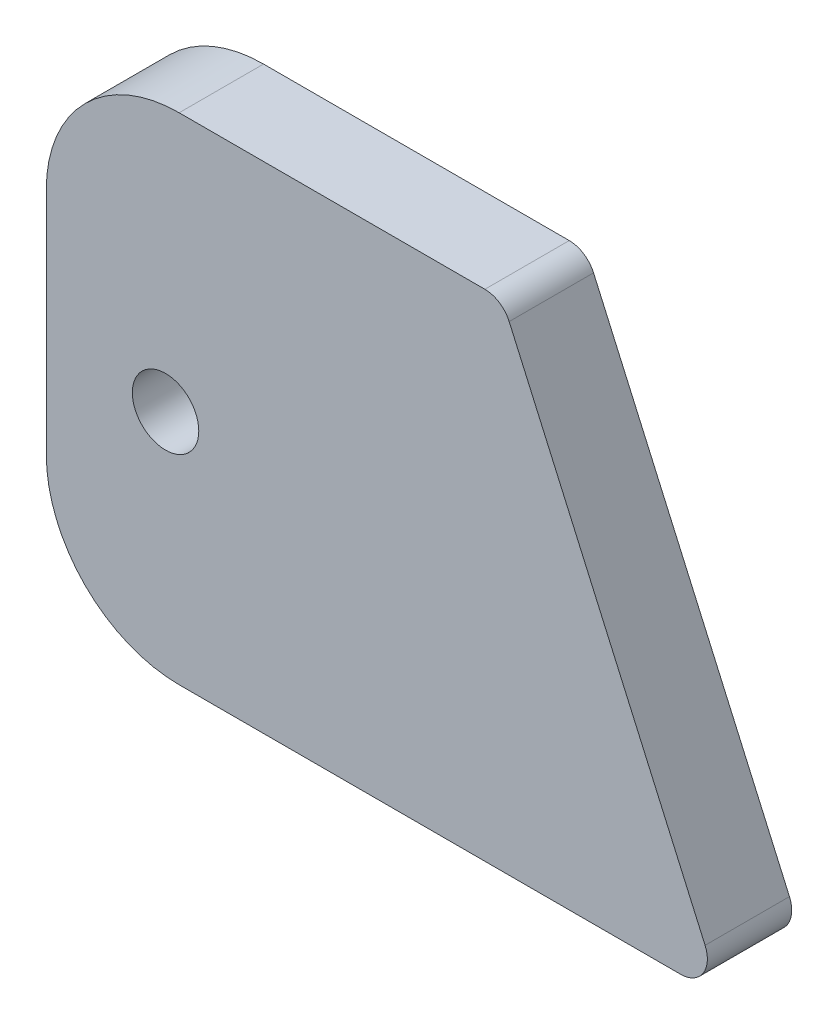
ISO-10303-21;
HEADER;
FILE_DESCRIPTION(('STEP AP214'),'2;1');
FILE_NAME('part.step','',(''),(''),'','','');
FILE_SCHEMA(('AUTOMOTIVE_DESIGN { 1 0 10303 214 1 1 1 1 }'));
ENDSEC;
DATA;
#1=APPLICATION_CONTEXT('core data for automotive mechanical design processes');
#2=APPLICATION_PROTOCOL_DEFINITION('international standard','automotive_design',2000,#1);
#3=PRODUCT_CONTEXT('',#1,'mechanical');
#4=PRODUCT('Part','Part','',(#3));
#5=PRODUCT_RELATED_PRODUCT_CATEGORY('part','',(#4));
#6=PRODUCT_DEFINITION_FORMATION('','',#4);
#7=PRODUCT_DEFINITION_CONTEXT('part definition',#1,'design');
#8=PRODUCT_DEFINITION('design','',#6,#7);
#9=PRODUCT_DEFINITION_SHAPE('','',#8);
#10=(LENGTH_UNIT() NAMED_UNIT(*) SI_UNIT(.MILLI.,.METRE.));
#11=(NAMED_UNIT(*) PLANE_ANGLE_UNIT() SI_UNIT($,.RADIAN.));
#12=(NAMED_UNIT(*) SI_UNIT($,.STERADIAN.) SOLID_ANGLE_UNIT());
#13=UNCERTAINTY_MEASURE_WITH_UNIT(LENGTH_MEASURE(1.E-05),#10,'distance_accuracy_value','');
#14=(GEOMETRIC_REPRESENTATION_CONTEXT(3) GLOBAL_UNCERTAINTY_ASSIGNED_CONTEXT((#13)) GLOBAL_UNIT_ASSIGNED_CONTEXT((#10,
#11,#12)) REPRESENTATION_CONTEXT('',''));
#15=CARTESIAN_POINT('',(0.,0.,0.));
#16=DIRECTION('',(0.,0.,1.));
#17=DIRECTION('',(1.,0.,0.));
#18=AXIS2_PLACEMENT_3D('',#15,#16,#17);
#19=CARTESIAN_POINT('',(5.33973329874302,9.32089354000001,1.5875));
#20=DIRECTION('',(-0.914302268590773,-0.405032543939084,0.));
#21=DIRECTION('',(0.405032543939084,-0.914302268590773,0.));
#22=AXIS2_PLACEMENT_3D('',#19,#20,#21);
#23=PLANE('',#22);
#24=DIRECTION('',(-0.405032543939084,0.914302268590773,0.));
#25=VECTOR('',#24,1.);
#26=CARTESIAN_POINT('',(5.33973329874302,9.32089354000001,1.5875));
#27=LINE('',#26,#25);
#28=CARTESIAN_POINT('',(12.9755521945606,-7.91586099606091,1.5875));
#29=VERTEX_POINT('',#28);
#30=CARTESIAN_POINT('',(5.60330169463111,8.72592608393909,1.5875));
#31=VERTEX_POINT('',#30);
#32=EDGE_CURVE('E126',#29,#31,#27,.T.);
#33=ORIENTED_EDGE('',*,*,#32,.F.);
#34=DIRECTION('',(0.,0.,-1.));
#35=VECTOR('',#34,1.);
#36=CARTESIAN_POINT('',(12.9755521945606,-7.91586099606091,1.5875));
#37=LINE('',#36,#35);
#38=CARTESIAN_POINT('',(12.9755521945606,-7.91586099606091,-1.5875));
#39=VERTEX_POINT('',#38);
#40=EDGE_CURVE('E112',#29,#39,#37,.T.);
#41=ORIENTED_EDGE('',*,*,#40,.T.);
#42=DIRECTION('',(-0.405032543939084,0.914302268590773,0.));
#43=VECTOR('',#42,1.);
#44=CARTESIAN_POINT('',(5.33973329874302,9.32089354000001,-1.5875));
#45=LINE('',#44,#43);
#46=CARTESIAN_POINT('',(5.60330169463111,8.72592608393909,-1.5875));
#47=VERTEX_POINT('',#46);
#48=EDGE_CURVE('E123',#39,#47,#45,.T.);
#49=ORIENTED_EDGE('',*,*,#48,.T.);
#50=DIRECTION('',(0.,0.,-1.));
#51=VECTOR('',#50,1.);
#52=CARTESIAN_POINT('',(5.60330169463111,8.72592608393909,1.5875));
#53=LINE('',#52,#51);
#54=EDGE_CURVE('E127',#47,#31,#53,.F.);
#55=ORIENTED_EDGE('',*,*,#54,.T.);
#56=EDGE_LOOP('',(#33,#41,#49,#55));
#57=FACE_BOUND('',#56,.T.);
#58=ADVANCED_FACE('F39',(#57),#23,.F.);
#59=CARTESIAN_POINT('',(4.68327461791519,9.32089354000001,1.5875));
#60=DIRECTION('',(0.,-1.,0.));
#61=DIRECTION('',(1.,0.,0.));
#62=AXIS2_PLACEMENT_3D('',#59,#60,#61);
#63=PLANE('',#62);
#64=DIRECTION('',(-1.,0.,0.));
#65=VECTOR('',#64,1.);
#66=CARTESIAN_POINT('',(4.68327461791519,9.32089354000001,-1.5875));
#67=LINE('',#66,#65);
#68=CARTESIAN_POINT('',(4.68899942604034,9.32089354000001,-1.5875));
#69=VERTEX_POINT('',#68);
#70=CARTESIAN_POINT('',(-6.81540086,9.32089354000001,-1.5875));
#71=VERTEX_POINT('',#70);
#72=EDGE_CURVE('E132',#69,#71,#67,.T.);
#73=ORIENTED_EDGE('',*,*,#72,.T.);
#74=DIRECTION('',(0.,0.,-1.));
#75=VECTOR('',#74,1.);
#76=CARTESIAN_POINT('',(-6.81540086,9.32089354000001,1.5875));
#77=LINE('',#76,#75);
#78=CARTESIAN_POINT('',(-6.81540086,9.32089353999998,1.5875));
#79=VERTEX_POINT('',#78);
#80=EDGE_CURVE('E62',#71,#79,#77,.F.);
#81=ORIENTED_EDGE('',*,*,#80,.T.);
#82=DIRECTION('',(-1.,0.,0.));
#83=VECTOR('',#82,1.);
#84=CARTESIAN_POINT('',(4.68327461791519,9.32089354000001,1.5875));
#85=LINE('',#84,#83);
#86=CARTESIAN_POINT('',(4.68899942604034,9.32089354000001,1.5875));
#87=VERTEX_POINT('',#86);
#88=EDGE_CURVE('E172',#87,#79,#85,.T.);
#89=ORIENTED_EDGE('',*,*,#88,.F.);
#90=DIRECTION('',(0.,0.,-1.));
#91=VECTOR('',#90,1.);
#92=CARTESIAN_POINT('',(4.68899942604034,9.32089354000001,1.5875));
#93=LINE('',#92,#91);
#94=EDGE_CURVE('E156',#87,#69,#93,.T.);
#95=ORIENTED_EDGE('',*,*,#94,.T.);
#96=EDGE_LOOP('',(#73,#81,#89,#95));
#97=FACE_BOUND('',#96,.T.);
#98=ADVANCED_FACE('F179',(#97),#63,.F.);
#99=CARTESIAN_POINT('',(-11.81540086,9.32089354,1.5875));
#100=DIRECTION('',(1.,0.,0.));
#101=DIRECTION('',(0.,1.,0.));
#102=AXIS2_PLACEMENT_3D('',#99,#100,#101);
#103=PLANE('',#102);
#104=DIRECTION('',(0.,-1.,0.));
#105=VECTOR('',#104,1.);
#106=CARTESIAN_POINT('',(-11.81540086,9.32089354,1.5875));
#107=LINE('',#106,#105);
#108=CARTESIAN_POINT('',(-11.81540086,4.32089354000001,1.5875));
#109=VERTEX_POINT('',#108);
#110=CARTESIAN_POINT('',(-11.81540086,-4.32089354,1.5875));
#111=VERTEX_POINT('',#110);
#112=EDGE_CURVE('E141',#109,#111,#107,.T.);
#113=ORIENTED_EDGE('',*,*,#112,.F.);
#114=DIRECTION('',(0.,0.,-1.));
#115=VECTOR('',#114,1.);
#116=CARTESIAN_POINT('',(-11.81540086,4.32089354000001,1.5875));
#117=LINE('',#116,#115);
#118=CARTESIAN_POINT('',(-11.81540086,4.32089354000001,-1.5875));
#119=VERTEX_POINT('',#118);
#120=EDGE_CURVE('E161',#109,#119,#117,.T.);
#121=ORIENTED_EDGE('',*,*,#120,.T.);
#122=DIRECTION('',(0.,-1.,0.));
#123=VECTOR('',#122,1.);
#124=CARTESIAN_POINT('',(-11.81540086,9.32089354,-1.5875));
#125=LINE('',#124,#123);
#126=CARTESIAN_POINT('',(-11.81540086,-4.32089354,-1.5875));
#127=VERTEX_POINT('',#126);
#128=EDGE_CURVE('E135',#119,#127,#125,.T.);
#129=ORIENTED_EDGE('',*,*,#128,.T.);
#130=DIRECTION('',(0.,0.,-1.));
#131=VECTOR('',#130,1.);
#132=CARTESIAN_POINT('',(-11.81540086,-4.32089354,1.5875));
#133=LINE('',#132,#131);
#134=EDGE_CURVE('E159',#127,#111,#133,.F.);
#135=ORIENTED_EDGE('',*,*,#134,.T.);
#136=EDGE_LOOP('',(#113,#121,#129,#135));
#137=FACE_BOUND('',#136,.T.);
#138=ADVANCED_FACE('F176',(#137),#103,.F.);
#139=CARTESIAN_POINT('',(-11.81540086,-9.32089354,1.5875));
#140=DIRECTION('',(0.,1.,0.));
#141=DIRECTION('',(-1.,0.,0.));
#142=AXIS2_PLACEMENT_3D('',#139,#140,#141);
#143=PLANE('',#142);
#144=DIRECTION('',(1.,0.,0.));
#145=VECTOR('',#144,1.);
#146=CARTESIAN_POINT('',(13.5979764465161,-9.32089353999999,1.5875));
#147=LINE('',#146,#145);
#148=CARTESIAN_POINT('',(-6.81540085999999,-9.32089353999994,1.5875));
#149=VERTEX_POINT('',#148);
#150=CARTESIAN_POINT('',(12.0612499259698,-9.32089353999999,1.5875));
#151=VERTEX_POINT('',#150);
#152=EDGE_CURVE('E148',#149,#151,#147,.T.);
#153=ORIENTED_EDGE('',*,*,#152,.F.);
#154=DIRECTION('',(0.,0.,-1.));
#155=VECTOR('',#154,1.);
#156=CARTESIAN_POINT('',(-6.81540086,-9.32089353999999,1.5875));
#157=LINE('',#156,#155);
#158=CARTESIAN_POINT('',(-6.81540086,-9.32089353999999,-1.5875));
#159=VERTEX_POINT('',#158);
#160=EDGE_CURVE('E11',#149,#159,#157,.T.);
#161=ORIENTED_EDGE('',*,*,#160,.T.);
#162=DIRECTION('',(1.,0.,0.));
#163=VECTOR('',#162,1.);
#164=CARTESIAN_POINT('',(-11.81540086,-9.32089354,-1.5875));
#165=LINE('',#164,#163);
#166=CARTESIAN_POINT('',(12.0612499259698,-9.32089353999999,-1.5875));
#167=VERTEX_POINT('',#166);
#168=EDGE_CURVE('E146',#159,#167,#165,.T.);
#169=ORIENTED_EDGE('',*,*,#168,.T.);
#170=DIRECTION('',(0.,0.,-1.));
#171=VECTOR('',#170,1.);
#172=CARTESIAN_POINT('',(12.0612499259698,-9.32089353999999,1.5875));
#173=LINE('',#172,#171);
#174=EDGE_CURVE('E114',#167,#151,#173,.F.);
#175=ORIENTED_EDGE('',*,*,#174,.T.);
#176=EDGE_LOOP('',(#153,#161,#169,#175));
#177=FACE_BOUND('',#176,.T.);
#178=ADVANCED_FACE('F193',(#177),#143,.F.);
#179=CARTESIAN_POINT('',(0.,0.,1.5875));
#180=DIRECTION('',(0.,0.,1.));
#181=DIRECTION('',(1.,0.,0.));
#182=AXIS2_PLACEMENT_3D('',#179,#180,#181);
#183=PLANE('',#182);
#184=CARTESIAN_POINT('',(-7.3274835,-0.67910646,1.5875));
#185=DIRECTION('',(0.,0.,1.));
#186=DIRECTION('',(1.,0.,0.));
#187=AXIS2_PLACEMENT_3D('',#184,#185,#186);
#188=CIRCLE('',#187,1.25);
#189=CARTESIAN_POINT('',(-6.0774835,-0.67910646,1.5875));
#190=VERTEX_POINT('',#189);
#191=EDGE_CURVE('E138',#190,#190,#188,.T.);
#192=ORIENTED_EDGE('',*,*,#191,.F.);
#193=EDGE_LOOP('',(#192));
#194=FACE_BOUND('',#193,.T.);
#195=ORIENTED_EDGE('',*,*,#88,.T.);
#196=CARTESIAN_POINT('',(-6.81540086,4.32089354,1.5875));
#197=DIRECTION('',(0.,0.,1.));
#198=DIRECTION('',(1.,0.,0.));
#199=AXIS2_PLACEMENT_3D('',#196,#197,#198);
#200=CIRCLE('',#199,5.);
#201=EDGE_CURVE('E47',#79,#109,#200,.T.);
#202=ORIENTED_EDGE('',*,*,#201,.T.);
#203=ORIENTED_EDGE('',*,*,#112,.T.);
#204=CARTESIAN_POINT('',(-6.81540086,-4.32089354,1.5875));
#205=DIRECTION('',(0.,0.,1.));
#206=DIRECTION('',(1.,0.,0.));
#207=AXIS2_PLACEMENT_3D('',#204,#205,#206);
#208=CIRCLE('',#207,5.);
#209=EDGE_CURVE('E54',#111,#149,#208,.T.);
#210=ORIENTED_EDGE('',*,*,#209,.T.);
#211=ORIENTED_EDGE('',*,*,#152,.T.);
#212=CARTESIAN_POINT('',(12.0612499259698,-8.32089353999999,1.5875));
#213=DIRECTION('',(0.,0.,1.));
#214=DIRECTION('',(1.,0.,0.));
#215=AXIS2_PLACEMENT_3D('',#212,#213,#214);
#216=CIRCLE('',#215,1.);
#217=EDGE_CURVE('E154',#151,#29,#216,.T.);
#218=ORIENTED_EDGE('',*,*,#217,.T.);
#219=ORIENTED_EDGE('',*,*,#32,.T.);
#220=CARTESIAN_POINT('',(4.68899942604034,8.32089354000001,1.5875));
#221=DIRECTION('',(0.,0.,1.));
#222=DIRECTION('',(1.,0.,0.));
#223=AXIS2_PLACEMENT_3D('',#220,#221,#222);
#224=CIRCLE('',#223,1.);
#225=EDGE_CURVE('E152',#31,#87,#224,.T.);
#226=ORIENTED_EDGE('',*,*,#225,.T.);
#227=EDGE_LOOP('',(#195,#202,#203,#210,#211,#218,#219,#226));
#228=FACE_BOUND('',#227,.T.);
#229=ADVANCED_FACE('F171',(#194,#228),#183,.T.);
#230=CARTESIAN_POINT('',(0.,0.,-1.5875));
#231=DIRECTION('',(0.,0.,1.));
#232=DIRECTION('',(1.,0.,0.));
#233=AXIS2_PLACEMENT_3D('',#230,#231,#232);
#234=PLANE('',#233);
#235=CARTESIAN_POINT('',(-7.3274835,-0.67910646,-1.5875));
#236=DIRECTION('',(0.,0.,1.));
#237=DIRECTION('',(1.,0.,0.));
#238=AXIS2_PLACEMENT_3D('',#235,#236,#237);
#239=CIRCLE('',#238,1.25);
#240=CARTESIAN_POINT('',(-6.0774835,-0.67910646,-1.5875));
#241=VERTEX_POINT('',#240);
#242=EDGE_CURVE('E133',#241,#241,#239,.T.);
#243=ORIENTED_EDGE('',*,*,#242,.T.);
#244=EDGE_LOOP('',(#243));
#245=FACE_BOUND('',#244,.T.);
#246=ORIENTED_EDGE('',*,*,#128,.F.);
#247=CARTESIAN_POINT('',(-6.81540086,4.32089354,-1.5875));
#248=DIRECTION('',(0.,0.,1.));
#249=DIRECTION('',(1.,0.,0.));
#250=AXIS2_PLACEMENT_3D('',#247,#248,#249);
#251=CIRCLE('',#250,5.);
#252=EDGE_CURVE('E166',#119,#71,#251,.F.);
#253=ORIENTED_EDGE('',*,*,#252,.T.);
#254=ORIENTED_EDGE('',*,*,#72,.F.);
#255=CARTESIAN_POINT('',(4.68899942604034,8.32089354000001,-1.5875));
#256=DIRECTION('',(0.,0.,1.));
#257=DIRECTION('',(1.,0.,0.));
#258=AXIS2_PLACEMENT_3D('',#255,#256,#257);
#259=CIRCLE('',#258,1.);
#260=EDGE_CURVE('E118',#69,#47,#259,.F.);
#261=ORIENTED_EDGE('',*,*,#260,.T.);
#262=ORIENTED_EDGE('',*,*,#48,.F.);
#263=CARTESIAN_POINT('',(12.0612499259698,-8.32089353999999,-1.5875));
#264=DIRECTION('',(0.,0.,1.));
#265=DIRECTION('',(1.,0.,0.));
#266=AXIS2_PLACEMENT_3D('',#263,#264,#265);
#267=CIRCLE('',#266,1.);
#268=EDGE_CURVE('E108',#39,#167,#267,.F.);
#269=ORIENTED_EDGE('',*,*,#268,.T.);
#270=ORIENTED_EDGE('',*,*,#168,.F.);
#271=CARTESIAN_POINT('',(-6.81540086,-4.32089354,-1.5875));
#272=DIRECTION('',(0.,0.,1.));
#273=DIRECTION('',(1.,0.,0.));
#274=AXIS2_PLACEMENT_3D('',#271,#272,#273);
#275=CIRCLE('',#274,5.);
#276=EDGE_CURVE('E164',#159,#127,#275,.F.);
#277=ORIENTED_EDGE('',*,*,#276,.T.);
#278=EDGE_LOOP('',(#246,#253,#254,#261,#262,#269,#270,#277));
#279=FACE_BOUND('',#278,.T.);
#280=ADVANCED_FACE('F130',(#245,#279),#234,.F.);
#281=CARTESIAN_POINT('',(12.0612499259698,-8.32089353999999,1.5875));
#282=DIRECTION('',(0.,0.,-1.));
#283=DIRECTION('',(-1.,0.,0.));
#284=AXIS2_PLACEMENT_3D('',#281,#282,#283);
#285=CYLINDRICAL_SURFACE('',#284,1.);
#286=ORIENTED_EDGE('',*,*,#217,.F.);
#287=ORIENTED_EDGE('',*,*,#174,.F.);
#288=ORIENTED_EDGE('',*,*,#268,.F.);
#289=ORIENTED_EDGE('',*,*,#40,.F.);
#290=EDGE_LOOP('',(#286,#287,#288,#289));
#291=FACE_BOUND('',#290,.T.);
#292=ADVANCED_FACE('F111',(#291),#285,.T.);
#293=CARTESIAN_POINT('',(4.68899942604034,8.32089354000001,1.5875));
#294=DIRECTION('',(0.,0.,-1.));
#295=DIRECTION('',(-1.,0.,0.));
#296=AXIS2_PLACEMENT_3D('',#293,#294,#295);
#297=CYLINDRICAL_SURFACE('',#296,1.);
#298=ORIENTED_EDGE('',*,*,#225,.F.);
#299=ORIENTED_EDGE('',*,*,#54,.F.);
#300=ORIENTED_EDGE('',*,*,#260,.F.);
#301=ORIENTED_EDGE('',*,*,#94,.F.);
#302=EDGE_LOOP('',(#298,#299,#300,#301));
#303=FACE_BOUND('',#302,.T.);
#304=ADVANCED_FACE('F183',(#303),#297,.T.);
#305=CARTESIAN_POINT('',(-6.81540086,4.32089354,1.5875));
#306=DIRECTION('',(0.,0.,-1.));
#307=DIRECTION('',(-1.,0.,0.));
#308=AXIS2_PLACEMENT_3D('',#305,#306,#307);
#309=CYLINDRICAL_SURFACE('',#308,5.);
#310=ORIENTED_EDGE('',*,*,#201,.F.);
#311=ORIENTED_EDGE('',*,*,#80,.F.);
#312=ORIENTED_EDGE('',*,*,#252,.F.);
#313=ORIENTED_EDGE('',*,*,#120,.F.);
#314=EDGE_LOOP('',(#310,#311,#312,#313));
#315=FACE_BOUND('',#314,.T.);
#316=ADVANCED_FACE('F178',(#315),#309,.T.);
#317=CARTESIAN_POINT('',(-6.81540086,-4.32089354,1.5875));
#318=DIRECTION('',(0.,0.,-1.));
#319=DIRECTION('',(-1.,0.,0.));
#320=AXIS2_PLACEMENT_3D('',#317,#318,#319);
#321=CYLINDRICAL_SURFACE('',#320,5.);
#322=ORIENTED_EDGE('',*,*,#209,.F.);
#323=ORIENTED_EDGE('',*,*,#134,.F.);
#324=ORIENTED_EDGE('',*,*,#276,.F.);
#325=ORIENTED_EDGE('',*,*,#160,.F.);
#326=EDGE_LOOP('',(#322,#323,#324,#325));
#327=FACE_BOUND('',#326,.T.);
#328=ADVANCED_FACE('F41',(#327),#321,.T.);
#329=CARTESIAN_POINT('',(-7.3274835,-0.67910646,-1.5875));
#330=DIRECTION('',(0.,0.,1.));
#331=DIRECTION('',(1.,0.,0.));
#332=AXIS2_PLACEMENT_3D('',#329,#330,#331);
#333=CYLINDRICAL_SURFACE('',#332,1.25);
#334=ORIENTED_EDGE('',*,*,#242,.F.);
#335=EDGE_LOOP('',(#334));
#336=FACE_BOUND('',#335,.T.);
#337=ORIENTED_EDGE('',*,*,#191,.T.);
#338=EDGE_LOOP('',(#337));
#339=FACE_BOUND('',#338,.T.);
#340=ADVANCED_FACE('F190',(#336,#339),#333,.F.);
#341=CLOSED_SHELL('',(#58,#98,#138,#178,#229,#280,#292,#304,#316,#328,#340));
#342=MANIFOLD_SOLID_BREP('B2',#341);
#343=ADVANCED_BREP_SHAPE_REPRESENTATION('',(#18,#342),#14);
#344=SHAPE_DEFINITION_REPRESENTATION(#9,#343);
ENDSEC;
END-ISO-10303-21;
